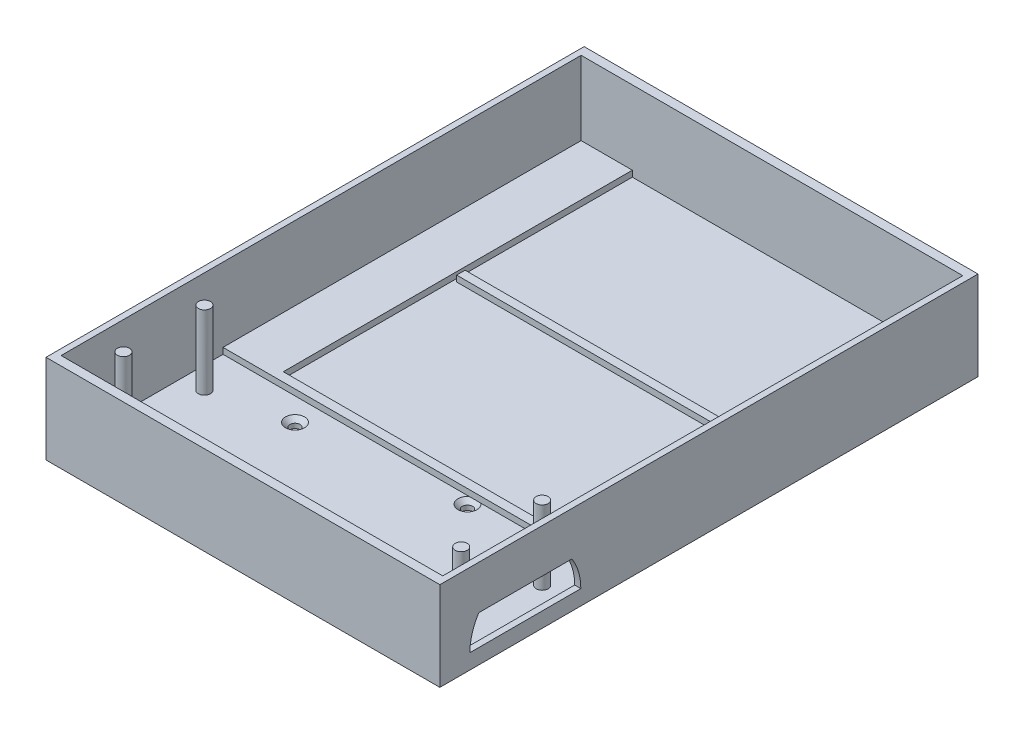
ISO-10303-21;
HEADER;
FILE_DESCRIPTION(('STEP AP214'),'2;1');
FILE_NAME('part.step','',(''),(''),'','','');
FILE_SCHEMA(('AUTOMOTIVE_DESIGN { 1 0 10303 214 1 1 1 1 }'));
ENDSEC;
DATA;
#1=APPLICATION_CONTEXT('core data for automotive mechanical design processes');
#2=APPLICATION_PROTOCOL_DEFINITION('international standard','automotive_design',2000,#1);
#3=PRODUCT_CONTEXT('',#1,'mechanical');
#4=PRODUCT('Part','Part','',(#3));
#5=PRODUCT_RELATED_PRODUCT_CATEGORY('part','',(#4));
#6=PRODUCT_DEFINITION_FORMATION('','',#4);
#7=PRODUCT_DEFINITION_CONTEXT('part definition',#1,'design');
#8=PRODUCT_DEFINITION('design','',#6,#7);
#9=PRODUCT_DEFINITION_SHAPE('','',#8);
#10=(LENGTH_UNIT() NAMED_UNIT(*) SI_UNIT(.MILLI.,.METRE.));
#11=(NAMED_UNIT(*) PLANE_ANGLE_UNIT() SI_UNIT($,.RADIAN.));
#12=(NAMED_UNIT(*) SI_UNIT($,.STERADIAN.) SOLID_ANGLE_UNIT());
#13=UNCERTAINTY_MEASURE_WITH_UNIT(LENGTH_MEASURE(1.E-05),#10,'distance_accuracy_value','');
#14=(GEOMETRIC_REPRESENTATION_CONTEXT(3) GLOBAL_UNCERTAINTY_ASSIGNED_CONTEXT((#13)) GLOBAL_UNIT_ASSIGNED_CONTEXT((#10,
#11,#12)) REPRESENTATION_CONTEXT('',''));
#15=CARTESIAN_POINT('',(0.,0.,0.));
#16=DIRECTION('',(0.,0.,1.));
#17=DIRECTION('',(1.,0.,0.));
#18=AXIS2_PLACEMENT_3D('',#15,#16,#17);
#19=CARTESIAN_POINT('',(0.,0.,0.));
#20=DIRECTION('',(0.,-1.,0.));
#21=DIRECTION('',(0.,0.,-1.));
#22=AXIS2_PLACEMENT_3D('',#19,#20,#21);
#23=PLANE('',#22);
#24=CARTESIAN_POINT('',(125.229028096428,0.,93.0079808969364));
#25=DIRECTION('',(0.,-1.,0.));
#26=DIRECTION('',(0.,0.,-1.));
#27=AXIS2_PLACEMENT_3D('',#24,#25,#26);
#28=CIRCLE('',#27,2.);
#29=CARTESIAN_POINT('',(125.229028096428,0.,91.0079808969364));
#30=VERTEX_POINT('',#29);
#31=EDGE_CURVE('E12',#30,#30,#28,.F.);
#32=ORIENTED_EDGE('',*,*,#31,.F.);
#33=EDGE_LOOP('',(#32));
#34=FACE_BOUND('',#33,.T.);
#35=CARTESIAN_POINT('',(13.2092889908256,0.,93.0079808969364));
#36=DIRECTION('',(0.,-1.,0.));
#37=DIRECTION('',(0.,0.,-1.));
#38=AXIS2_PLACEMENT_3D('',#35,#36,#37);
#39=CIRCLE('',#38,2.);
#40=CARTESIAN_POINT('',(13.2092889908256,0.,91.0079808969364));
#41=VERTEX_POINT('',#40);
#42=EDGE_CURVE('E115',#41,#41,#39,.F.);
#43=ORIENTED_EDGE('',*,*,#42,.F.);
#44=EDGE_LOOP('',(#43));
#45=FACE_BOUND('',#44,.T.);
#46=CARTESIAN_POINT('',(13.2092889908256,0.,119.857980896936));
#47=DIRECTION('',(0.,-1.,0.));
#48=DIRECTION('',(0.,0.,-1.));
#49=AXIS2_PLACEMENT_3D('',#46,#47,#48);
#50=CIRCLE('',#49,2.);
#51=CARTESIAN_POINT('',(13.2092889908256,0.,117.857980896936));
#52=VERTEX_POINT('',#51);
#53=EDGE_CURVE('E502',#52,#52,#50,.F.);
#54=ORIENTED_EDGE('',*,*,#53,.F.);
#55=EDGE_LOOP('',(#54));
#56=FACE_BOUND('',#55,.T.);
#57=CARTESIAN_POINT('',(125.229028096428,0.,119.857980896936));
#58=DIRECTION('',(0.,-1.,0.));
#59=DIRECTION('',(0.,0.,-1.));
#60=AXIS2_PLACEMENT_3D('',#57,#58,#59);
#61=CIRCLE('',#60,2.);
#62=CARTESIAN_POINT('',(125.229028096428,0.,117.857980896936));
#63=VERTEX_POINT('',#62);
#64=EDGE_CURVE('E499',#63,#63,#61,.F.);
#65=ORIENTED_EDGE('',*,*,#64,.F.);
#66=EDGE_LOOP('',(#65));
#67=FACE_BOUND('',#66,.T.);
#68=CARTESIAN_POINT('',(37.4340889908256,0.,87.1829808969364));
#69=DIRECTION('',(0.,1.,0.));
#70=DIRECTION('',(0.,0.,1.));
#71=AXIS2_PLACEMENT_3D('',#68,#69,#70);
#72=CIRCLE('',#71,3.15);
#73=CARTESIAN_POINT('',(37.4340889908256,0.,90.3329808969364));
#74=VERTEX_POINT('',#73);
#75=EDGE_CURVE('E385',#74,#74,#72,.T.);
#76=ORIENTED_EDGE('',*,*,#75,.F.);
#77=EDGE_LOOP('',(#76));
#78=FACE_BOUND('',#77,.T.);
#79=CARTESIAN_POINT('',(37.4340889908256,0.,115.082980896936));
#80=DIRECTION('',(0.,1.,0.));
#81=DIRECTION('',(0.,0.,1.));
#82=AXIS2_PLACEMENT_3D('',#79,#80,#81);
#83=CIRCLE('',#82,3.15);
#84=CARTESIAN_POINT('',(37.4340889908256,0.,118.232980896936));
#85=VERTEX_POINT('',#84);
#86=EDGE_CURVE('E376',#85,#85,#83,.T.);
#87=ORIENTED_EDGE('',*,*,#86,.F.);
#88=EDGE_LOOP('',(#87));
#89=FACE_BOUND('',#88,.T.);
#90=DIRECTION('',(0.,0.,-1.));
#91=VECTOR('',#90,1.);
#92=CARTESIAN_POINT('',(5.95678899082561,0.,133.282980896936));
#93=LINE('',#92,#91);
#94=CARTESIAN_POINT('',(5.95678899082561,0.,133.282980896936));
#95=VERTEX_POINT('',#94);
#96=CARTESIAN_POINT('',(5.95678899082561,0.,79.5829808969364));
#97=VERTEX_POINT('',#96);
#98=EDGE_CURVE('E346',#95,#97,#93,.T.);
#99=ORIENTED_EDGE('',*,*,#98,.F.);
#100=DIRECTION('',(1.,0.,0.));
#101=VECTOR('',#100,1.);
#102=CARTESIAN_POINT('',(0.,0.,133.282980896936));
#103=LINE('',#102,#101);
#104=CARTESIAN_POINT('',(87.2736203552105,0.,133.282980896936));
#105=VERTEX_POINT('',#104);
#106=EDGE_CURVE('E484',#95,#105,#103,.T.);
#107=ORIENTED_EDGE('',*,*,#106,.T.);
#108=CARTESIAN_POINT('',(88.2340889908256,0.,130.282980896936));
#109=DIRECTION('',(0.,1.,0.));
#110=DIRECTION('',(0.,0.,1.));
#111=AXIS2_PLACEMENT_3D('',#108,#109,#110);
#112=CIRCLE('',#111,3.15);
#113=CARTESIAN_POINT('',(89.1945576264407,0.,133.282980896936));
#114=VERTEX_POINT('',#113);
#115=EDGE_CURVE('E367',#114,#105,#112,.T.);
#116=ORIENTED_EDGE('',*,*,#115,.F.);
#117=CARTESIAN_POINT('',(132.529028096428,0.,133.282980896936));
#118=VERTEX_POINT('',#117);
#119=EDGE_CURVE('E483',#114,#118,#103,.T.);
#120=ORIENTED_EDGE('',*,*,#119,.T.);
#121=DIRECTION('',(0.,0.,1.));
#122=VECTOR('',#121,1.);
#123=CARTESIAN_POINT('',(132.529028096428,0.,133.282980896936));
#124=LINE('',#123,#122);
#125=CARTESIAN_POINT('',(132.529028096428,0.,79.5829808969364));
#126=VERTEX_POINT('',#125);
#127=EDGE_CURVE('E359',#126,#118,#124,.T.);
#128=ORIENTED_EDGE('',*,*,#127,.F.);
#129=DIRECTION('',(1.,0.,0.));
#130=VECTOR('',#129,1.);
#131=CARTESIAN_POINT('',(0.,0.,79.5829808969364));
#132=LINE('',#131,#130);
#133=CARTESIAN_POINT('',(91.4504657804992,0.,79.5829808969364));
#134=VERTEX_POINT('',#133);
#135=EDGE_CURVE('E425',#134,#126,#132,.T.);
#136=ORIENTED_EDGE('',*,*,#135,.F.);
#137=CARTESIAN_POINT('',(89.5340889908256,0.,82.0829808969364));
#138=DIRECTION('',(0.,1.,0.));
#139=DIRECTION('',(0.,0.,1.));
#140=AXIS2_PLACEMENT_3D('',#137,#138,#139);
#141=CIRCLE('',#140,3.15);
#142=CARTESIAN_POINT('',(87.617712201152,0.,79.5829808969364));
#143=VERTEX_POINT('',#142);
#144=EDGE_CURVE('E394',#143,#134,#141,.T.);
#145=ORIENTED_EDGE('',*,*,#144,.F.);
#146=EDGE_CURVE('E409',#97,#143,#132,.T.);
#147=ORIENTED_EDGE('',*,*,#146,.F.);
#148=EDGE_LOOP('',(#99,#107,#116,#120,#128,#136,#145,#147));
#149=FACE_BOUND('',#148,.T.);
#150=ADVANCED_FACE('F107',(#34,#45,#56,#67,#78,#89,#149),#23,.F.);
#151=CARTESIAN_POINT('',(0.,2.,79.5829808969364));
#152=DIRECTION('',(0.,0.,-1.));
#153=DIRECTION('',(-1.,0.,0.));
#154=AXIS2_PLACEMENT_3D('',#151,#152,#153);
#155=PLANE('',#154);
#156=DIRECTION('',(0.,-1.,0.));
#157=VECTOR('',#156,1.);
#158=CARTESIAN_POINT('',(5.95678899082561,24.,79.5829808969364));
#159=LINE('',#158,#157);
#160=CARTESIAN_POINT('',(5.95678899082561,2.,79.5829808969364));
#161=VERTEX_POINT('',#160);
#162=EDGE_CURVE('E354',#161,#97,#159,.T.);
#163=ORIENTED_EDGE('',*,*,#162,.T.);
#164=ORIENTED_EDGE('',*,*,#146,.T.);
#165=EDGE_CURVE('E427',#143,#134,#132,.T.);
#166=ORIENTED_EDGE('',*,*,#165,.T.);
#167=ORIENTED_EDGE('',*,*,#135,.T.);
#168=DIRECTION('',(0.,-1.,0.));
#169=VECTOR('',#168,1.);
#170=CARTESIAN_POINT('',(132.529028096428,24.,79.5829808969364));
#171=LINE('',#170,#169);
#172=CARTESIAN_POINT('',(132.529028096428,2.,79.5829808969364));
#173=VERTEX_POINT('',#172);
#174=EDGE_CURVE('E364',#173,#126,#171,.T.);
#175=ORIENTED_EDGE('',*,*,#174,.F.);
#176=DIRECTION('',(1.,0.,0.));
#177=VECTOR('',#176,1.);
#178=CARTESIAN_POINT('',(0.,2.,79.5829808969364));
#179=LINE('',#178,#177);
#180=EDGE_CURVE('E413',#161,#173,#179,.T.);
#181=ORIENTED_EDGE('',*,*,#180,.F.);
#182=EDGE_LOOP('',(#163,#164,#166,#167,#175,#181));
#183=FACE_BOUND('',#182,.T.);
#184=ADVANCED_FACE('F511',(#183),#155,.F.);
#185=CARTESIAN_POINT('',(0.,2.,133.282980896936));
#186=DIRECTION('',(0.,0.,-1.));
#187=DIRECTION('',(-1.,0.,0.));
#188=AXIS2_PLACEMENT_3D('',#185,#186,#187);
#189=PLANE('',#188);
#190=ORIENTED_EDGE('',*,*,#106,.F.);
#191=DIRECTION('',(0.,-1.,0.));
#192=VECTOR('',#191,1.);
#193=CARTESIAN_POINT('',(5.95678899082561,24.,133.282980896936));
#194=LINE('',#193,#192);
#195=CARTESIAN_POINT('',(5.95678899082561,26.5,133.282980896936));
#196=VERTEX_POINT('',#195);
#197=EDGE_CURVE('E357',#196,#95,#194,.T.);
#198=ORIENTED_EDGE('',*,*,#197,.F.);
#199=DIRECTION('',(-1.,0.,0.));
#200=VECTOR('',#199,1.);
#201=CARTESIAN_POINT('',(0.,26.5,133.282980896936));
#202=LINE('',#201,#200);
#203=CARTESIAN_POINT('',(132.529028096428,26.5,133.282980896936));
#204=VERTEX_POINT('',#203);
#205=EDGE_CURVE('E299',#204,#196,#202,.T.);
#206=ORIENTED_EDGE('',*,*,#205,.F.);
#207=DIRECTION('',(0.,-1.,0.));
#208=VECTOR('',#207,1.);
#209=CARTESIAN_POINT('',(132.529028096428,24.,133.282980896936));
#210=LINE('',#209,#208);
#211=EDGE_CURVE('E361',#204,#118,#210,.T.);
#212=ORIENTED_EDGE('',*,*,#211,.T.);
#213=ORIENTED_EDGE('',*,*,#119,.F.);
#214=EDGE_CURVE('E486',#105,#114,#103,.T.);
#215=ORIENTED_EDGE('',*,*,#214,.F.);
#216=EDGE_LOOP('',(#190,#198,#206,#212,#213,#215));
#217=FACE_BOUND('',#216,.T.);
#218=ADVANCED_FACE('F533',(#217),#189,.T.);
#219=DIRECTION('',(0.,0.,-1.));
#220=VECTOR('',#219,1.);
#221=CARTESIAN_POINT('',(22.9467889908256,0.,0.));
#222=LINE('',#221,#220);
#223=CARTESIAN_POINT('',(22.9467889908256,0.,76.5829808969364));
#224=VERTEX_POINT('',#223);
#225=CARTESIAN_POINT('',(22.9467889908256,0.,-39.175622542595));
#226=VERTEX_POINT('',#225);
#227=EDGE_CURVE('E417',#224,#226,#222,.T.);
#228=ORIENTED_EDGE('',*,*,#227,.F.);
#229=DIRECTION('',(1.,0.,0.));
#230=VECTOR('',#229,1.);
#231=CARTESIAN_POINT('',(0.,0.,76.5829808969364));
#232=LINE('',#231,#230);
#233=CARTESIAN_POINT('',(109.146788990826,0.,76.5829808969364));
#234=VERTEX_POINT('',#233);
#235=EDGE_CURVE('E404',#224,#234,#232,.T.);
#236=ORIENTED_EDGE('',*,*,#235,.T.);
#237=DIRECTION('',(0.,0.,1.));
#238=VECTOR('',#237,1.);
#239=CARTESIAN_POINT('',(109.146788990826,0.,0.));
#240=LINE('',#239,#238);
#241=CARTESIAN_POINT('',(109.146788990826,0.,-39.1756225425949));
#242=VERTEX_POINT('',#241);
#243=EDGE_CURVE('E422',#242,#234,#240,.T.);
#244=ORIENTED_EDGE('',*,*,#243,.F.);
#245=DIRECTION('',(-1.,0.,0.));
#246=VECTOR('',#245,1.);
#247=CARTESIAN_POINT('',(1.81223658961723E-13,0.,-39.1756225425951));
#248=LINE('',#247,#246);
#249=EDGE_CURVE('E420',#242,#226,#248,.T.);
#250=ORIENTED_EDGE('',*,*,#249,.T.);
#251=EDGE_LOOP('',(#228,#236,#244,#250));
#252=FACE_BOUND('',#251,.T.);
#253=DIRECTION('',(1.,0.,0.));
#254=VECTOR('',#253,1.);
#255=CARTESIAN_POINT('',(0.,0.,17.2843774574049));
#256=LINE('',#255,#254);
#257=CARTESIAN_POINT('',(23.9467889908256,0.,17.2843774574049));
#258=VERTEX_POINT('',#257);
#259=CARTESIAN_POINT('',(108.146788990826,0.,17.2843774574049));
#260=VERTEX_POINT('',#259);
#261=EDGE_CURVE('E453',#258,#260,#256,.T.);
#262=ORIENTED_EDGE('',*,*,#261,.T.);
#263=DIRECTION('',(0.,0.,1.));
#264=VECTOR('',#263,1.);
#265=CARTESIAN_POINT('',(108.146788990826,0.,0.));
#266=LINE('',#265,#264);
#267=CARTESIAN_POINT('',(108.146788990826,0.,20.0829808969364));
#268=VERTEX_POINT('',#267);
#269=EDGE_CURVE('E439',#260,#268,#266,.T.);
#270=ORIENTED_EDGE('',*,*,#269,.T.);
#271=DIRECTION('',(1.,0.,0.));
#272=VECTOR('',#271,1.);
#273=CARTESIAN_POINT('',(0.,0.,20.0829808969364));
#274=LINE('',#273,#272);
#275=CARTESIAN_POINT('',(23.9467889908256,0.,20.0829808969364));
#276=VERTEX_POINT('',#275);
#277=EDGE_CURVE('E444',#276,#268,#274,.T.);
#278=ORIENTED_EDGE('',*,*,#277,.F.);
#279=DIRECTION('',(0.,0.,1.));
#280=VECTOR('',#279,1.);
#281=CARTESIAN_POINT('',(23.9467889908256,0.,0.));
#282=LINE('',#281,#280);
#283=EDGE_CURVE('E455',#258,#276,#282,.T.);
#284=ORIENTED_EDGE('',*,*,#283,.F.);
#285=EDGE_LOOP('',(#262,#270,#278,#284));
#286=FACE_BOUND('',#285,.T.);
#287=ADVANCED_FACE('F514',(#252,#286),#23,.F.);
#288=CARTESIAN_POINT('',(108.146788990826,2.,0.));
#289=DIRECTION('',(1.,0.,0.));
#290=DIRECTION('',(0.,0.,-1.));
#291=AXIS2_PLACEMENT_3D('',#288,#289,#290);
#292=PLANE('',#291);
#293=ORIENTED_EDGE('',*,*,#269,.F.);
#294=DIRECTION('',(0.,-1.,0.));
#295=VECTOR('',#294,1.);
#296=CARTESIAN_POINT('',(108.146788990826,2.,17.2843774574049));
#297=LINE('',#296,#295);
#298=CARTESIAN_POINT('',(108.146788990826,2.,17.2843774574049));
#299=VERTEX_POINT('',#298);
#300=EDGE_CURVE('E468',#299,#260,#297,.T.);
#301=ORIENTED_EDGE('',*,*,#300,.F.);
#302=DIRECTION('',(0.,0.,1.));
#303=VECTOR('',#302,1.);
#304=CARTESIAN_POINT('',(108.146788990826,2.,0.));
#305=LINE('',#304,#303);
#306=CARTESIAN_POINT('',(108.146788990826,2.,20.0829808969364));
#307=VERTEX_POINT('',#306);
#308=EDGE_CURVE('E440',#299,#307,#305,.T.);
#309=ORIENTED_EDGE('',*,*,#308,.T.);
#310=DIRECTION('',(0.,-1.,0.));
#311=VECTOR('',#310,1.);
#312=CARTESIAN_POINT('',(108.146788990826,2.,20.0829808969364));
#313=LINE('',#312,#311);
#314=EDGE_CURVE('E451',#307,#268,#313,.T.);
#315=ORIENTED_EDGE('',*,*,#314,.T.);
#316=EDGE_LOOP('',(#293,#301,#309,#315));
#317=FACE_BOUND('',#316,.T.);
#318=ADVANCED_FACE('F621',(#317),#292,.T.);
#319=CARTESIAN_POINT('',(0.,2.,17.2843774574049));
#320=DIRECTION('',(0.,0.,-1.));
#321=DIRECTION('',(-1.,0.,0.));
#322=AXIS2_PLACEMENT_3D('',#319,#320,#321);
#323=PLANE('',#322);
#324=ORIENTED_EDGE('',*,*,#261,.F.);
#325=DIRECTION('',(0.,-1.,0.));
#326=VECTOR('',#325,1.);
#327=CARTESIAN_POINT('',(23.9467889908255,2.,17.2843774574049));
#328=LINE('',#327,#326);
#329=CARTESIAN_POINT('',(23.9467889908255,2.,17.2843774574049));
#330=VERTEX_POINT('',#329);
#331=EDGE_CURVE('E465',#330,#258,#328,.T.);
#332=ORIENTED_EDGE('',*,*,#331,.F.);
#333=DIRECTION('',(1.,0.,0.));
#334=VECTOR('',#333,1.);
#335=CARTESIAN_POINT('',(0.,2.,17.2843774574049));
#336=LINE('',#335,#334);
#337=EDGE_CURVE('E443',#330,#299,#336,.T.);
#338=ORIENTED_EDGE('',*,*,#337,.T.);
#339=ORIENTED_EDGE('',*,*,#300,.T.);
#340=EDGE_LOOP('',(#324,#332,#338,#339));
#341=FACE_BOUND('',#340,.T.);
#342=ADVANCED_FACE('F617',(#341),#323,.T.);
#343=CARTESIAN_POINT('',(23.9467889908256,2.,0.));
#344=DIRECTION('',(1.,0.,0.));
#345=DIRECTION('',(0.,0.,-1.));
#346=AXIS2_PLACEMENT_3D('',#343,#344,#345);
#347=PLANE('',#346);
#348=ORIENTED_EDGE('',*,*,#283,.T.);
#349=DIRECTION('',(0.,-1.,0.));
#350=VECTOR('',#349,1.);
#351=CARTESIAN_POINT('',(23.9467889908256,2.,20.0829808969364));
#352=LINE('',#351,#350);
#353=CARTESIAN_POINT('',(23.9467889908256,2.,20.0829808969364));
#354=VERTEX_POINT('',#353);
#355=EDGE_CURVE('E462',#354,#276,#352,.T.);
#356=ORIENTED_EDGE('',*,*,#355,.F.);
#357=DIRECTION('',(0.,0.,1.));
#358=VECTOR('',#357,1.);
#359=CARTESIAN_POINT('',(23.9467889908256,2.,0.));
#360=LINE('',#359,#358);
#361=EDGE_CURVE('E447',#330,#354,#360,.T.);
#362=ORIENTED_EDGE('',*,*,#361,.F.);
#363=ORIENTED_EDGE('',*,*,#331,.T.);
#364=EDGE_LOOP('',(#348,#356,#362,#363));
#365=FACE_BOUND('',#364,.T.);
#366=ADVANCED_FACE('F613',(#365),#347,.F.);
#367=CARTESIAN_POINT('',(0.,2.,20.0829808969364));
#368=DIRECTION('',(0.,0.,-1.));
#369=DIRECTION('',(-1.,0.,0.));
#370=AXIS2_PLACEMENT_3D('',#367,#368,#369);
#371=PLANE('',#370);
#372=ORIENTED_EDGE('',*,*,#277,.T.);
#373=ORIENTED_EDGE('',*,*,#314,.F.);
#374=DIRECTION('',(1.,0.,0.));
#375=VECTOR('',#374,1.);
#376=CARTESIAN_POINT('',(0.,2.,20.0829808969364));
#377=LINE('',#376,#375);
#378=EDGE_CURVE('E449',#354,#307,#377,.T.);
#379=ORIENTED_EDGE('',*,*,#378,.F.);
#380=ORIENTED_EDGE('',*,*,#355,.T.);
#381=EDGE_LOOP('',(#372,#373,#379,#380));
#382=FACE_BOUND('',#381,.T.);
#383=ADVANCED_FACE('F609',(#382),#371,.F.);
#384=CARTESIAN_POINT('',(0.,2.,0.));
#385=DIRECTION('',(0.,1.,0.));
#386=DIRECTION('',(0.,0.,1.));
#387=AXIS2_PLACEMENT_3D('',#384,#385,#386);
#388=PLANE('',#387);
#389=ORIENTED_EDGE('',*,*,#308,.F.);
#390=ORIENTED_EDGE('',*,*,#337,.F.);
#391=ORIENTED_EDGE('',*,*,#361,.T.);
#392=ORIENTED_EDGE('',*,*,#378,.T.);
#393=EDGE_LOOP('',(#389,#390,#391,#392));
#394=FACE_BOUND('',#393,.T.);
#395=ADVANCED_FACE('F605',(#394),#388,.T.);
#396=CARTESIAN_POINT('',(0.,2.,76.5829808969364));
#397=DIRECTION('',(0.,0.,-1.));
#398=DIRECTION('',(-1.,0.,0.));
#399=AXIS2_PLACEMENT_3D('',#396,#397,#398);
#400=PLANE('',#399);
#401=ORIENTED_EDGE('',*,*,#235,.F.);
#402=DIRECTION('',(0.,-1.,0.));
#403=VECTOR('',#402,1.);
#404=CARTESIAN_POINT('',(22.9467889908256,2.,76.5829808969364));
#405=LINE('',#404,#403);
#406=CARTESIAN_POINT('',(22.9467889908256,2.,76.5829808969364));
#407=VERTEX_POINT('',#406);
#408=EDGE_CURVE('E436',#407,#224,#405,.T.);
#409=ORIENTED_EDGE('',*,*,#408,.F.);
#410=DIRECTION('',(1.,0.,0.));
#411=VECTOR('',#410,1.);
#412=CARTESIAN_POINT('',(0.,2.,76.5829808969364));
#413=LINE('',#412,#411);
#414=CARTESIAN_POINT('',(109.146788990826,2.,76.5829808969364));
#415=VERTEX_POINT('',#414);
#416=EDGE_CURVE('E405',#407,#415,#413,.T.);
#417=ORIENTED_EDGE('',*,*,#416,.T.);
#418=DIRECTION('',(0.,-1.,0.));
#419=VECTOR('',#418,1.);
#420=CARTESIAN_POINT('',(109.146788990826,2.,76.5829808969364));
#421=LINE('',#420,#419);
#422=EDGE_CURVE('E415',#415,#234,#421,.T.);
#423=ORIENTED_EDGE('',*,*,#422,.T.);
#424=EDGE_LOOP('',(#401,#409,#417,#423));
#425=FACE_BOUND('',#424,.T.);
#426=ADVANCED_FACE('F601',(#425),#400,.T.);
#427=CARTESIAN_POINT('',(22.9467889908256,2.,0.));
#428=DIRECTION('',(-1.,0.,0.));
#429=DIRECTION('',(0.,0.,1.));
#430=AXIS2_PLACEMENT_3D('',#427,#428,#429);
#431=PLANE('',#430);
#432=ORIENTED_EDGE('',*,*,#227,.T.);
#433=DIRECTION('',(0.,-1.,0.));
#434=VECTOR('',#433,1.);
#435=CARTESIAN_POINT('',(22.9467889908256,2.,-39.1756225425951));
#436=LINE('',#435,#434);
#437=CARTESIAN_POINT('',(22.9467889908256,2.,-39.1756225425951));
#438=VERTEX_POINT('',#437);
#439=EDGE_CURVE('E433',#438,#226,#436,.T.);
#440=ORIENTED_EDGE('',*,*,#439,.F.);
#441=DIRECTION('',(0.,0.,-1.));
#442=VECTOR('',#441,1.);
#443=CARTESIAN_POINT('',(22.9467889908256,2.,0.));
#444=LINE('',#443,#442);
#445=EDGE_CURVE('E408',#407,#438,#444,.T.);
#446=ORIENTED_EDGE('',*,*,#445,.F.);
#447=ORIENTED_EDGE('',*,*,#408,.T.);
#448=EDGE_LOOP('',(#432,#440,#446,#447));
#449=FACE_BOUND('',#448,.T.);
#450=ADVANCED_FACE('F597',(#449),#431,.F.);
#451=CARTESIAN_POINT('',(1.81223658961723E-13,2.,-39.1756225425951));
#452=DIRECTION('',(0.,0.,1.));
#453=DIRECTION('',(1.,0.,0.));
#454=AXIS2_PLACEMENT_3D('',#451,#452,#453);
#455=PLANE('',#454);
#456=ORIENTED_EDGE('',*,*,#249,.F.);
#457=DIRECTION('',(0.,-1.,0.));
#458=VECTOR('',#457,1.);
#459=CARTESIAN_POINT('',(109.146788990826,2.,-39.1756225425949));
#460=LINE('',#459,#458);
#461=CARTESIAN_POINT('',(109.146788990826,2.,-39.1756225425949));
#462=VERTEX_POINT('',#461);
#463=EDGE_CURVE('E430',#462,#242,#460,.T.);
#464=ORIENTED_EDGE('',*,*,#463,.F.);
#465=DIRECTION('',(-1.,0.,0.));
#466=VECTOR('',#465,1.);
#467=CARTESIAN_POINT('',(0.,2.,-39.175622542595));
#468=LINE('',#467,#466);
#469=CARTESIAN_POINT('',(132.529028096428,2.,-39.175622542595));
#470=VERTEX_POINT('',#469);
#471=EDGE_CURVE('E324',#470,#462,#468,.T.);
#472=ORIENTED_EDGE('',*,*,#471,.F.);
#473=DIRECTION('',(0.,-1.,0.));
#474=VECTOR('',#473,1.);
#475=CARTESIAN_POINT('',(132.529028096428,24.,-39.175622542595));
#476=LINE('',#475,#474);
#477=CARTESIAN_POINT('',(132.529028096428,26.5,-39.175622542595));
#478=VERTEX_POINT('',#477);
#479=EDGE_CURVE('E326',#478,#470,#476,.T.);
#480=ORIENTED_EDGE('',*,*,#479,.F.);
#481=DIRECTION('',(1.,0.,0.));
#482=VECTOR('',#481,1.);
#483=CARTESIAN_POINT('',(0.,26.5,-39.175622542595));
#484=LINE('',#483,#482);
#485=CARTESIAN_POINT('',(5.95678899082561,26.5,-39.175622542595));
#486=VERTEX_POINT('',#485);
#487=EDGE_CURVE('E305',#486,#478,#484,.T.);
#488=ORIENTED_EDGE('',*,*,#487,.F.);
#489=DIRECTION('',(0.,-1.,0.));
#490=VECTOR('',#489,1.);
#491=CARTESIAN_POINT('',(5.95678899082561,24.,-39.175622542595));
#492=LINE('',#491,#490);
#493=CARTESIAN_POINT('',(5.95678899082561,2.,-39.175622542595));
#494=VERTEX_POINT('',#493);
#495=EDGE_CURVE('E328',#486,#494,#492,.T.);
#496=ORIENTED_EDGE('',*,*,#495,.T.);
#497=EDGE_CURVE('E129',#438,#494,#468,.T.);
#498=ORIENTED_EDGE('',*,*,#497,.F.);
#499=ORIENTED_EDGE('',*,*,#439,.T.);
#500=EDGE_LOOP('',(#456,#464,#472,#480,#488,#496,#498,#499));
#501=FACE_BOUND('',#500,.T.);
#502=ADVANCED_FACE('F593',(#501),#455,.T.);
#503=CARTESIAN_POINT('',(109.146788990826,2.,0.));
#504=DIRECTION('',(1.,0.,0.));
#505=DIRECTION('',(0.,0.,-1.));
#506=AXIS2_PLACEMENT_3D('',#503,#504,#505);
#507=PLANE('',#506);
#508=ORIENTED_EDGE('',*,*,#243,.T.);
#509=ORIENTED_EDGE('',*,*,#422,.F.);
#510=DIRECTION('',(0.,0.,1.));
#511=VECTOR('',#510,1.);
#512=CARTESIAN_POINT('',(109.146788990826,2.,0.));
#513=LINE('',#512,#511);
#514=EDGE_CURVE('E411',#462,#415,#513,.T.);
#515=ORIENTED_EDGE('',*,*,#514,.F.);
#516=ORIENTED_EDGE('',*,*,#463,.T.);
#517=EDGE_LOOP('',(#508,#509,#515,#516));
#518=FACE_BOUND('',#517,.T.);
#519=ADVANCED_FACE('F587',(#518),#507,.F.);
#520=CARTESIAN_POINT('',(0.,2.,0.));
#521=DIRECTION('',(0.,1.,0.));
#522=DIRECTION('',(0.,0.,1.));
#523=AXIS2_PLACEMENT_3D('',#520,#521,#522);
#524=PLANE('',#523);
#525=ORIENTED_EDGE('',*,*,#471,.T.);
#526=ORIENTED_EDGE('',*,*,#514,.T.);
#527=ORIENTED_EDGE('',*,*,#416,.F.);
#528=ORIENTED_EDGE('',*,*,#445,.T.);
#529=ORIENTED_EDGE('',*,*,#497,.T.);
#530=DIRECTION('',(0.,0.,1.));
#531=VECTOR('',#530,1.);
#532=CARTESIAN_POINT('',(5.95678899082561,2.,-42.1756225425951));
#533=LINE('',#532,#531);
#534=EDGE_CURVE('E323',#494,#161,#533,.T.);
#535=ORIENTED_EDGE('',*,*,#534,.T.);
#536=ORIENTED_EDGE('',*,*,#180,.T.);
#537=DIRECTION('',(0.,0.,1.));
#538=VECTOR('',#537,1.);
#539=CARTESIAN_POINT('',(132.529028096428,2.,-42.1756225425951));
#540=LINE('',#539,#538);
#541=EDGE_CURVE('E122',#470,#173,#540,.T.);
#542=ORIENTED_EDGE('',*,*,#541,.F.);
#543=EDGE_LOOP('',(#525,#526,#527,#528,#529,#535,#536,#542));
#544=FACE_BOUND('',#543,.T.);
#545=ADVANCED_FACE('F584',(#544),#524,.T.);
#546=CARTESIAN_POINT('',(0.,2.,136.282980896936));
#547=DIRECTION('',(0.,0.,-1.));
#548=DIRECTION('',(-1.,0.,0.));
#549=AXIS2_PLACEMENT_3D('',#546,#547,#548);
#550=PLANE('',#549);
#551=DIRECTION('',(0.,-1.,0.));
#552=VECTOR('',#551,1.);
#553=CARTESIAN_POINT('',(3.9567889908256,2.,136.282980896936));
#554=LINE('',#553,#552);
#555=CARTESIAN_POINT('',(3.95678899082561,26.5,136.282980896936));
#556=VERTEX_POINT('',#555);
#557=CARTESIAN_POINT('',(3.9567889908256,-3.,136.282980896936));
#558=VERTEX_POINT('',#557);
#559=EDGE_CURVE('E268',#556,#558,#554,.T.);
#560=ORIENTED_EDGE('',*,*,#559,.T.);
#561=DIRECTION('',(-1.,0.,0.));
#562=VECTOR('',#561,1.);
#563=CARTESIAN_POINT('',(3.9567889908256,-3.,136.282980896936));
#564=LINE('',#563,#562);
#565=CARTESIAN_POINT('',(134.576788990826,-3.,136.282980896936));
#566=VERTEX_POINT('',#565);
#567=EDGE_CURVE('E477',#566,#558,#564,.T.);
#568=ORIENTED_EDGE('',*,*,#567,.F.);
#569=DIRECTION('',(0.,-1.,0.));
#570=VECTOR('',#569,1.);
#571=CARTESIAN_POINT('',(134.576788990826,2.,136.282980896936));
#572=LINE('',#571,#570);
#573=CARTESIAN_POINT('',(134.576788990826,26.5,136.282980896936));
#574=VERTEX_POINT('',#573);
#575=EDGE_CURVE('E280',#574,#566,#572,.T.);
#576=ORIENTED_EDGE('',*,*,#575,.F.);
#577=DIRECTION('',(1.,0.,0.));
#578=VECTOR('',#577,1.);
#579=CARTESIAN_POINT('',(0.,26.5,136.282980896936));
#580=LINE('',#579,#578);
#581=EDGE_CURVE('E283',#556,#574,#580,.T.);
#582=ORIENTED_EDGE('',*,*,#581,.F.);
#583=EDGE_LOOP('',(#560,#568,#576,#582));
#584=FACE_BOUND('',#583,.T.);
#585=ADVANCED_FACE('F284',(#584),#550,.F.);
#586=CARTESIAN_POINT('',(0.,-3.,0.));
#587=DIRECTION('',(0.,-1.,0.));
#588=DIRECTION('',(0.,0.,-1.));
#589=AXIS2_PLACEMENT_3D('',#586,#587,#588);
#590=PLANE('',#589);
#591=CARTESIAN_POINT('',(88.2340889908256,-3.,130.282980896936));
#592=DIRECTION('',(0.,1.,0.));
#593=DIRECTION('',(0.,0.,1.));
#594=AXIS2_PLACEMENT_3D('',#591,#592,#593);
#595=CIRCLE('',#594,1.69999999999999);
#596=CARTESIAN_POINT('',(88.2340889908256,-3.,131.982980896936));
#597=VERTEX_POINT('',#596);
#598=EDGE_CURVE('E373',#597,#597,#595,.T.);
#599=ORIENTED_EDGE('',*,*,#598,.T.);
#600=EDGE_LOOP('',(#599));
#601=FACE_BOUND('',#600,.T.);
#602=CARTESIAN_POINT('',(37.4340889908256,-3.,115.082980896936));
#603=DIRECTION('',(0.,1.,0.));
#604=DIRECTION('',(0.,0.,1.));
#605=AXIS2_PLACEMENT_3D('',#602,#603,#604);
#606=CIRCLE('',#605,1.7);
#607=CARTESIAN_POINT('',(37.4340889908256,-3.,116.782980896936));
#608=VERTEX_POINT('',#607);
#609=EDGE_CURVE('E382',#608,#608,#606,.T.);
#610=ORIENTED_EDGE('',*,*,#609,.T.);
#611=EDGE_LOOP('',(#610));
#612=FACE_BOUND('',#611,.T.);
#613=CARTESIAN_POINT('',(37.4340889908256,-3.,87.1829808969364));
#614=DIRECTION('',(0.,1.,0.));
#615=DIRECTION('',(0.,0.,1.));
#616=AXIS2_PLACEMENT_3D('',#613,#614,#615);
#617=CIRCLE('',#616,1.7);
#618=CARTESIAN_POINT('',(37.4340889908256,-3.,88.8829808969364));
#619=VERTEX_POINT('',#618);
#620=EDGE_CURVE('E391',#619,#619,#617,.T.);
#621=ORIENTED_EDGE('',*,*,#620,.T.);
#622=EDGE_LOOP('',(#621));
#623=FACE_BOUND('',#622,.T.);
#624=CARTESIAN_POINT('',(89.5340889908256,-3.,82.0829808969364));
#625=DIRECTION('',(0.,1.,0.));
#626=DIRECTION('',(0.,0.,1.));
#627=AXIS2_PLACEMENT_3D('',#624,#625,#626);
#628=CIRCLE('',#627,1.69999999999999);
#629=CARTESIAN_POINT('',(89.5340889908256,-3.,83.7829808969364));
#630=VERTEX_POINT('',#629);
#631=EDGE_CURVE('E401',#630,#630,#628,.T.);
#632=ORIENTED_EDGE('',*,*,#631,.T.);
#633=EDGE_LOOP('',(#632));
#634=FACE_BOUND('',#633,.T.);
#635=DIRECTION('',(0.,0.,-1.));
#636=VECTOR('',#635,1.);
#637=CARTESIAN_POINT('',(3.9567889908256,-3.,136.282980896936));
#638=LINE('',#637,#636);
#639=CARTESIAN_POINT('',(3.9567889908256,-3.,-42.1756225425951));
#640=VERTEX_POINT('',#639);
#641=EDGE_CURVE('E275',#558,#640,#638,.T.);
#642=ORIENTED_EDGE('',*,*,#641,.T.);
#643=DIRECTION('',(1.,0.,0.));
#644=VECTOR('',#643,1.);
#645=CARTESIAN_POINT('',(3.9567889908256,-3.,-42.1756225425951));
#646=LINE('',#645,#644);
#647=CARTESIAN_POINT('',(134.576788990826,-3.,-42.1756225425951));
#648=VERTEX_POINT('',#647);
#649=EDGE_CURVE('E472',#640,#648,#646,.T.);
#650=ORIENTED_EDGE('',*,*,#649,.T.);
#651=DIRECTION('',(0.,0.,1.));
#652=VECTOR('',#651,1.);
#653=CARTESIAN_POINT('',(134.576788990826,-3.,136.282980896936));
#654=LINE('',#653,#652);
#655=EDGE_CURVE('E474',#648,#566,#654,.T.);
#656=ORIENTED_EDGE('',*,*,#655,.T.);
#657=ORIENTED_EDGE('',*,*,#567,.T.);
#658=EDGE_LOOP('',(#642,#650,#656,#657));
#659=FACE_BOUND('',#658,.T.);
#660=ADVANCED_FACE('F626',(#601,#612,#623,#634,#659),#590,.T.);
#661=CARTESIAN_POINT('',(3.9567889908256,-3.,-42.1756225425951));
#662=DIRECTION('',(0.,0.,1.));
#663=DIRECTION('',(1.,0.,0.));
#664=AXIS2_PLACEMENT_3D('',#661,#662,#663);
#665=PLANE('',#664);
#666=DIRECTION('',(0.,1.,0.));
#667=VECTOR('',#666,1.);
#668=CARTESIAN_POINT('',(3.9567889908256,-3.,-42.1756225425951));
#669=LINE('',#668,#667);
#670=CARTESIAN_POINT('',(3.95678899082561,26.5,-42.1756225425951));
#671=VERTEX_POINT('',#670);
#672=EDGE_CURVE('E481',#640,#671,#669,.T.);
#673=ORIENTED_EDGE('',*,*,#672,.T.);
#674=DIRECTION('',(-1.,0.,0.));
#675=VECTOR('',#674,1.);
#676=CARTESIAN_POINT('',(0.,26.5,-42.1756225425951));
#677=LINE('',#676,#675);
#678=CARTESIAN_POINT('',(134.576788990826,26.5,-42.1756225425951));
#679=VERTEX_POINT('',#678);
#680=EDGE_CURVE('E294',#679,#671,#677,.T.);
#681=ORIENTED_EDGE('',*,*,#680,.F.);
#682=DIRECTION('',(0.,1.,0.));
#683=VECTOR('',#682,1.);
#684=CARTESIAN_POINT('',(134.576788990826,-3.,-42.1756225425951));
#685=LINE('',#684,#683);
#686=EDGE_CURVE('E479',#648,#679,#685,.T.);
#687=ORIENTED_EDGE('',*,*,#686,.F.);
#688=ORIENTED_EDGE('',*,*,#649,.F.);
#689=EDGE_LOOP('',(#673,#681,#687,#688));
#690=FACE_BOUND('',#689,.T.);
#691=ADVANCED_FACE('F628',(#690),#665,.F.);
#692=CARTESIAN_POINT('',(3.95678899082595,2.,0.));
#693=DIRECTION('',(1.,0.,0.));
#694=DIRECTION('',(0.,0.,-1.));
#695=AXIS2_PLACEMENT_3D('',#692,#693,#694);
#696=PLANE('',#695);
#697=ORIENTED_EDGE('',*,*,#559,.F.);
#698=DIRECTION('',(0.,0.,1.));
#699=VECTOR('',#698,1.);
#700=CARTESIAN_POINT('',(3.95678899082561,26.5,0.));
#701=LINE('',#700,#699);
#702=EDGE_CURVE('E273',#671,#556,#701,.T.);
#703=ORIENTED_EDGE('',*,*,#702,.F.);
#704=ORIENTED_EDGE('',*,*,#672,.F.);
#705=ORIENTED_EDGE('',*,*,#641,.F.);
#706=EDGE_LOOP('',(#697,#703,#704,#705));
#707=FACE_BOUND('',#706,.T.);
#708=ADVANCED_FACE('F270',(#707),#696,.F.);
#709=CARTESIAN_POINT('',(134.576788990826,2.,0.));
#710=DIRECTION('',(1.,0.,0.));
#711=DIRECTION('',(0.,0.,-1.));
#712=AXIS2_PLACEMENT_3D('',#709,#710,#711);
#713=PLANE('',#712);
#714=DIRECTION('',(0.,0.,1.));
#715=VECTOR('',#714,1.);
#716=CARTESIAN_POINT('',(134.576788990826,12.,0.));
#717=LINE('',#716,#715);
#718=CARTESIAN_POINT('',(134.576788990826,12.,92.4875932358901));
#719=VERTEX_POINT('',#718);
#720=CARTESIAN_POINT('',(134.576788990826,12.,123.378368557983));
#721=VERTEX_POINT('',#720);
#722=EDGE_CURVE('E330',#719,#721,#717,.T.);
#723=ORIENTED_EDGE('',*,*,#722,.F.);
#724=CARTESIAN_POINT('',(134.576788990826,2.,107.932980896936));
#725=DIRECTION('',(1.,0.,0.));
#726=DIRECTION('',(0.,0.,-1.));
#727=AXIS2_PLACEMENT_3D('',#724,#725,#726);
#728=CIRCLE('',#727,18.4);
#729=CARTESIAN_POINT('',(134.576788990826,2.,89.5329808969364));
#730=VERTEX_POINT('',#729);
#731=EDGE_CURVE('E340',#730,#719,#728,.T.);
#732=ORIENTED_EDGE('',*,*,#731,.F.);
#733=DIRECTION('',(0.,0.,1.));
#734=VECTOR('',#733,1.);
#735=CARTESIAN_POINT('',(134.576788990826,2.,0.));
#736=LINE('',#735,#734);
#737=CARTESIAN_POINT('',(134.576788990826,2.,126.332980896936));
#738=VERTEX_POINT('',#737);
#739=EDGE_CURVE('E337',#730,#738,#736,.T.);
#740=ORIENTED_EDGE('',*,*,#739,.T.);
#741=CARTESIAN_POINT('',(134.576788990826,2.,107.932980896936));
#742=DIRECTION('',(1.,0.,0.));
#743=DIRECTION('',(0.,0.,-1.));
#744=AXIS2_PLACEMENT_3D('',#741,#742,#743);
#745=CIRCLE('',#744,18.4);
#746=EDGE_CURVE('E334',#721,#738,#745,.T.);
#747=ORIENTED_EDGE('',*,*,#746,.F.);
#748=EDGE_LOOP('',(#723,#732,#740,#747));
#749=FACE_BOUND('',#748,.T.);
#750=ORIENTED_EDGE('',*,*,#686,.T.);
#751=DIRECTION('',(0.,0.,-1.));
#752=VECTOR('',#751,1.);
#753=CARTESIAN_POINT('',(134.576788990826,26.5,0.));
#754=LINE('',#753,#752);
#755=EDGE_CURVE('E288',#574,#679,#754,.T.);
#756=ORIENTED_EDGE('',*,*,#755,.F.);
#757=ORIENTED_EDGE('',*,*,#575,.T.);
#758=ORIENTED_EDGE('',*,*,#655,.F.);
#759=EDGE_LOOP('',(#750,#756,#757,#758));
#760=FACE_BOUND('',#759,.T.);
#761=ADVANCED_FACE('F109',(#749,#760),#713,.T.);
#762=CARTESIAN_POINT('',(92.6840889908256,0.,82.0829808969364));
#763=DIRECTION('',(0.,1.,0.));
#764=DIRECTION('',(0.,0.,1.));
#765=AXIS2_PLACEMENT_3D('',#762,#763,#764);
#766=PLANE('',#765);
#767=EDGE_CURVE('E395',#134,#143,#141,.T.);
#768=ORIENTED_EDGE('',*,*,#767,.F.);
#769=ORIENTED_EDGE('',*,*,#165,.F.);
#770=EDGE_LOOP('',(#768,#769));
#771=FACE_BOUND('',#770,.T.);
#772=ADVANCED_FACE('F579',(#771),#766,.F.);
#773=CARTESIAN_POINT('',(89.5340889908256,0.,82.0829808969364));
#774=DIRECTION('',(0.,1.,0.));
#775=DIRECTION('',(0.,0.,1.));
#776=AXIS2_PLACEMENT_3D('',#773,#774,#775);
#777=CYLINDRICAL_SURFACE('',#776,1.69999999999999);
#778=ORIENTED_EDGE('',*,*,#631,.F.);
#779=EDGE_LOOP('',(#778));
#780=FACE_BOUND('',#779,.T.);
#781=CARTESIAN_POINT('',(89.5340889908256,-1.45,82.0829808969364));
#782=DIRECTION('',(0.,1.,0.));
#783=DIRECTION('',(0.,0.,1.));
#784=AXIS2_PLACEMENT_3D('',#781,#782,#783);
#785=CIRCLE('',#784,1.69999999999999);
#786=CARTESIAN_POINT('',(89.5340889908256,-1.45,83.7829808969364));
#787=VERTEX_POINT('',#786);
#788=EDGE_CURVE('E398',#787,#787,#785,.T.);
#789=ORIENTED_EDGE('',*,*,#788,.T.);
#790=EDGE_LOOP('',(#789));
#791=FACE_BOUND('',#790,.T.);
#792=ADVANCED_FACE('F575',(#780,#791),#777,.F.);
#793=CARTESIAN_POINT('',(89.5340889908256,0.,82.0829808969364));
#794=DIRECTION('',(0.,1.,0.));
#795=DIRECTION('',(0.,0.,1.));
#796=AXIS2_PLACEMENT_3D('',#793,#794,#795);
#797=CONICAL_SURFACE('',#796,3.15,0.78539816339745);
#798=ORIENTED_EDGE('',*,*,#788,.F.);
#799=EDGE_LOOP('',(#798));
#800=FACE_BOUND('',#799,.T.);
#801=ORIENTED_EDGE('',*,*,#767,.T.);
#802=ORIENTED_EDGE('',*,*,#144,.T.);
#803=EDGE_LOOP('',(#801,#802));
#804=FACE_BOUND('',#803,.T.);
#805=ADVANCED_FACE('F571',(#800,#804),#797,.F.);
#806=CARTESIAN_POINT('',(37.4340889908256,0.,87.1829808969364));
#807=DIRECTION('',(0.,1.,0.));
#808=DIRECTION('',(0.,0.,1.));
#809=AXIS2_PLACEMENT_3D('',#806,#807,#808);
#810=CYLINDRICAL_SURFACE('',#809,1.7);
#811=ORIENTED_EDGE('',*,*,#620,.F.);
#812=EDGE_LOOP('',(#811));
#813=FACE_BOUND('',#812,.T.);
#814=CARTESIAN_POINT('',(37.4340889908256,-1.45,87.1829808969364));
#815=DIRECTION('',(0.,1.,0.));
#816=DIRECTION('',(0.,0.,1.));
#817=AXIS2_PLACEMENT_3D('',#814,#815,#816);
#818=CIRCLE('',#817,1.7);
#819=CARTESIAN_POINT('',(37.4340889908256,-1.45,88.8829808969364));
#820=VERTEX_POINT('',#819);
#821=EDGE_CURVE('E388',#820,#820,#818,.T.);
#822=ORIENTED_EDGE('',*,*,#821,.T.);
#823=EDGE_LOOP('',(#822));
#824=FACE_BOUND('',#823,.T.);
#825=ADVANCED_FACE('F567',(#813,#824),#810,.F.);
#826=CARTESIAN_POINT('',(37.4340889908256,0.,87.1829808969364));
#827=DIRECTION('',(0.,1.,0.));
#828=DIRECTION('',(0.,0.,1.));
#829=AXIS2_PLACEMENT_3D('',#826,#827,#828);
#830=CONICAL_SURFACE('',#829,3.15,0.785398163397448);
#831=ORIENTED_EDGE('',*,*,#821,.F.);
#832=EDGE_LOOP('',(#831));
#833=FACE_BOUND('',#832,.T.);
#834=ORIENTED_EDGE('',*,*,#75,.T.);
#835=EDGE_LOOP('',(#834));
#836=FACE_BOUND('',#835,.T.);
#837=ADVANCED_FACE('F563',(#833,#836),#830,.F.);
#838=CARTESIAN_POINT('',(37.4340889908256,0.,115.082980896936));
#839=DIRECTION('',(0.,1.,0.));
#840=DIRECTION('',(0.,0.,1.));
#841=AXIS2_PLACEMENT_3D('',#838,#839,#840);
#842=CYLINDRICAL_SURFACE('',#841,1.7);
#843=ORIENTED_EDGE('',*,*,#609,.F.);
#844=EDGE_LOOP('',(#843));
#845=FACE_BOUND('',#844,.T.);
#846=CARTESIAN_POINT('',(37.4340889908256,-1.45,115.082980896936));
#847=DIRECTION('',(0.,1.,0.));
#848=DIRECTION('',(0.,0.,1.));
#849=AXIS2_PLACEMENT_3D('',#846,#847,#848);
#850=CIRCLE('',#849,1.7);
#851=CARTESIAN_POINT('',(37.4340889908256,-1.45,116.782980896936));
#852=VERTEX_POINT('',#851);
#853=EDGE_CURVE('E379',#852,#852,#850,.T.);
#854=ORIENTED_EDGE('',*,*,#853,.T.);
#855=EDGE_LOOP('',(#854));
#856=FACE_BOUND('',#855,.T.);
#857=ADVANCED_FACE('F556',(#845,#856),#842,.F.);
#858=CARTESIAN_POINT('',(37.4340889908256,0.,115.082980896936));
#859=DIRECTION('',(0.,1.,0.));
#860=DIRECTION('',(0.,0.,1.));
#861=AXIS2_PLACEMENT_3D('',#858,#859,#860);
#862=CONICAL_SURFACE('',#861,3.15,0.785398163397448);
#863=ORIENTED_EDGE('',*,*,#853,.F.);
#864=EDGE_LOOP('',(#863));
#865=FACE_BOUND('',#864,.T.);
#866=ORIENTED_EDGE('',*,*,#86,.T.);
#867=EDGE_LOOP('',(#866));
#868=FACE_BOUND('',#867,.T.);
#869=ADVANCED_FACE('F548',(#865,#868),#862,.F.);
#870=CARTESIAN_POINT('',(91.3840889908256,0.,130.282980896936));
#871=DIRECTION('',(0.,1.,0.));
#872=DIRECTION('',(0.,0.,1.));
#873=AXIS2_PLACEMENT_3D('',#870,#871,#872);
#874=PLANE('',#873);
#875=ORIENTED_EDGE('',*,*,#214,.T.);
#876=EDGE_CURVE('E366',#105,#114,#112,.T.);
#877=ORIENTED_EDGE('',*,*,#876,.F.);
#878=EDGE_LOOP('',(#875,#877));
#879=FACE_BOUND('',#878,.T.);
#880=ADVANCED_FACE('F545',(#879),#874,.F.);
#881=CARTESIAN_POINT('',(88.2340889908256,0.,130.282980896936));
#882=DIRECTION('',(0.,1.,0.));
#883=DIRECTION('',(0.,0.,1.));
#884=AXIS2_PLACEMENT_3D('',#881,#882,#883);
#885=CYLINDRICAL_SURFACE('',#884,1.69999999999999);
#886=ORIENTED_EDGE('',*,*,#598,.F.);
#887=EDGE_LOOP('',(#886));
#888=FACE_BOUND('',#887,.T.);
#889=CARTESIAN_POINT('',(88.2340889908256,-1.45,130.282980896936));
#890=DIRECTION('',(0.,1.,0.));
#891=DIRECTION('',(0.,0.,1.));
#892=AXIS2_PLACEMENT_3D('',#889,#890,#891);
#893=CIRCLE('',#892,1.69999999999999);
#894=CARTESIAN_POINT('',(88.2340889908256,-1.45,131.982980896936));
#895=VERTEX_POINT('',#894);
#896=EDGE_CURVE('E370',#895,#895,#893,.T.);
#897=ORIENTED_EDGE('',*,*,#896,.T.);
#898=EDGE_LOOP('',(#897));
#899=FACE_BOUND('',#898,.T.);
#900=ADVANCED_FACE('F547',(#888,#899),#885,.F.);
#901=CARTESIAN_POINT('',(88.2340889908256,0.,130.282980896936));
#902=DIRECTION('',(0.,1.,0.));
#903=DIRECTION('',(0.,0.,1.));
#904=AXIS2_PLACEMENT_3D('',#901,#902,#903);
#905=CONICAL_SURFACE('',#904,3.15,0.78539816339745);
#906=ORIENTED_EDGE('',*,*,#896,.F.);
#907=EDGE_LOOP('',(#906));
#908=FACE_BOUND('',#907,.T.);
#909=ORIENTED_EDGE('',*,*,#115,.T.);
#910=ORIENTED_EDGE('',*,*,#876,.T.);
#911=EDGE_LOOP('',(#909,#910));
#912=FACE_BOUND('',#911,.T.);
#913=ADVANCED_FACE('F544',(#908,#912),#905,.F.);
#914=CARTESIAN_POINT('',(132.529028096428,24.,133.282980896936));
#915=DIRECTION('',(1.,0.,0.));
#916=DIRECTION('',(0.,0.,-1.));
#917=AXIS2_PLACEMENT_3D('',#914,#915,#916);
#918=PLANE('',#917);
#919=CARTESIAN_POINT('',(132.529028096428,2.,107.932980896936));
#920=DIRECTION('',(1.,0.,0.));
#921=DIRECTION('',(0.,0.,-1.));
#922=AXIS2_PLACEMENT_3D('',#919,#920,#921);
#923=CIRCLE('',#922,18.4);
#924=CARTESIAN_POINT('',(132.529028096428,2.,89.5329808969364));
#925=VERTEX_POINT('',#924);
#926=CARTESIAN_POINT('',(132.529028096428,12.,92.4875932358901));
#927=VERTEX_POINT('',#926);
#928=EDGE_CURVE('E493',#925,#927,#923,.T.);
#929=ORIENTED_EDGE('',*,*,#928,.T.);
#930=DIRECTION('',(0.,0.,1.));
#931=VECTOR('',#930,1.);
#932=CARTESIAN_POINT('',(132.529028096428,12.,133.282980896936));
#933=LINE('',#932,#931);
#934=CARTESIAN_POINT('',(132.529028096428,12.,123.378368557983));
#935=VERTEX_POINT('',#934);
#936=EDGE_CURVE('E496',#927,#935,#933,.T.);
#937=ORIENTED_EDGE('',*,*,#936,.T.);
#938=CARTESIAN_POINT('',(132.529028096428,2.,107.932980896936));
#939=DIRECTION('',(1.,0.,0.));
#940=DIRECTION('',(0.,0.,-1.));
#941=AXIS2_PLACEMENT_3D('',#938,#939,#940);
#942=CIRCLE('',#941,18.4);
#943=CARTESIAN_POINT('',(132.529028096428,2.,126.332980896936));
#944=VERTEX_POINT('',#943);
#945=EDGE_CURVE('E279',#935,#944,#942,.T.);
#946=ORIENTED_EDGE('',*,*,#945,.T.);
#947=DIRECTION('',(0.,0.,1.));
#948=VECTOR('',#947,1.);
#949=CARTESIAN_POINT('',(132.529028096428,2.,133.282980896936));
#950=LINE('',#949,#948);
#951=EDGE_CURVE('E490',#925,#944,#950,.T.);
#952=ORIENTED_EDGE('',*,*,#951,.F.);
#953=EDGE_LOOP('',(#929,#937,#946,#952));
#954=FACE_BOUND('',#953,.T.);
#955=ORIENTED_EDGE('',*,*,#127,.T.);
#956=ORIENTED_EDGE('',*,*,#211,.F.);
#957=DIRECTION('',(0.,0.,1.));
#958=VECTOR('',#957,1.);
#959=CARTESIAN_POINT('',(132.529028096428,26.5,0.));
#960=LINE('',#959,#958);
#961=EDGE_CURVE('E308',#478,#204,#960,.T.);
#962=ORIENTED_EDGE('',*,*,#961,.F.);
#963=ORIENTED_EDGE('',*,*,#479,.T.);
#964=ORIENTED_EDGE('',*,*,#541,.T.);
#965=ORIENTED_EDGE('',*,*,#174,.T.);
#966=EDGE_LOOP('',(#955,#956,#962,#963,#964,#965));
#967=FACE_BOUND('',#966,.T.);
#968=ADVANCED_FACE('F760',(#954,#967),#918,.F.);
#969=CARTESIAN_POINT('',(5.95678899082561,24.,133.282980896936));
#970=DIRECTION('',(-1.,0.,0.));
#971=DIRECTION('',(0.,0.,1.));
#972=AXIS2_PLACEMENT_3D('',#969,#970,#971);
#973=PLANE('',#972);
#974=ORIENTED_EDGE('',*,*,#98,.T.);
#975=ORIENTED_EDGE('',*,*,#162,.F.);
#976=ORIENTED_EDGE('',*,*,#534,.F.);
#977=ORIENTED_EDGE('',*,*,#495,.F.);
#978=DIRECTION('',(0.,0.,-1.));
#979=VECTOR('',#978,1.);
#980=CARTESIAN_POINT('',(5.95678899082561,26.5,0.));
#981=LINE('',#980,#979);
#982=EDGE_CURVE('E302',#196,#486,#981,.T.);
#983=ORIENTED_EDGE('',*,*,#982,.F.);
#984=ORIENTED_EDGE('',*,*,#197,.T.);
#985=EDGE_LOOP('',(#974,#975,#976,#977,#983,#984));
#986=FACE_BOUND('',#985,.T.);
#987=ADVANCED_FACE('F773',(#986),#973,.F.);
#988=CARTESIAN_POINT('',(112.576788990826,12.,0.));
#989=DIRECTION('',(0.,1.,0.));
#990=DIRECTION('',(0.,0.,1.));
#991=AXIS2_PLACEMENT_3D('',#988,#989,#990);
#992=PLANE('',#991);
#993=DIRECTION('',(1.,0.,0.));
#994=VECTOR('',#993,1.);
#995=CARTESIAN_POINT('',(112.576788990826,12.,92.4875932358901));
#996=LINE('',#995,#994);
#997=EDGE_CURVE('E344',#927,#719,#996,.T.);
#998=ORIENTED_EDGE('',*,*,#997,.T.);
#999=ORIENTED_EDGE('',*,*,#722,.T.);
#1000=DIRECTION('',(1.,0.,0.));
#1001=VECTOR('',#1000,1.);
#1002=CARTESIAN_POINT('',(112.576788990826,12.,123.378368557983));
#1003=LINE('',#1002,#1001);
#1004=EDGE_CURVE('E343',#935,#721,#1003,.T.);
#1005=ORIENTED_EDGE('',*,*,#1004,.F.);
#1006=ORIENTED_EDGE('',*,*,#936,.F.);
#1007=EDGE_LOOP('',(#998,#999,#1005,#1006));
#1008=FACE_BOUND('',#1007,.T.);
#1009=ADVANCED_FACE('F767',(#1008),#992,.F.);
#1010=CARTESIAN_POINT('',(112.576788990826,2.,107.932980896936));
#1011=DIRECTION('',(1.,0.,0.));
#1012=DIRECTION('',(0.,0.,-1.));
#1013=AXIS2_PLACEMENT_3D('',#1010,#1011,#1012);
#1014=CYLINDRICAL_SURFACE('',#1013,18.4);
#1015=DIRECTION('',(1.,0.,0.));
#1016=VECTOR('',#1015,1.);
#1017=CARTESIAN_POINT('',(112.576788990826,2.,89.5329808969364));
#1018=LINE('',#1017,#1016);
#1019=EDGE_CURVE('E347',#925,#730,#1018,.T.);
#1020=ORIENTED_EDGE('',*,*,#1019,.T.);
#1021=ORIENTED_EDGE('',*,*,#731,.T.);
#1022=ORIENTED_EDGE('',*,*,#997,.F.);
#1023=ORIENTED_EDGE('',*,*,#928,.F.);
#1024=EDGE_LOOP('',(#1020,#1021,#1022,#1023));
#1025=FACE_BOUND('',#1024,.T.);
#1026=ADVANCED_FACE('F772',(#1025),#1014,.F.);
#1027=CARTESIAN_POINT('',(112.576788990826,2.,0.));
#1028=DIRECTION('',(0.,1.,0.));
#1029=DIRECTION('',(0.,0.,1.));
#1030=AXIS2_PLACEMENT_3D('',#1027,#1028,#1029);
#1031=PLANE('',#1030);
#1032=ORIENTED_EDGE('',*,*,#951,.T.);
#1033=DIRECTION('',(1.,0.,0.));
#1034=VECTOR('',#1033,1.);
#1035=CARTESIAN_POINT('',(112.576788990826,2.,126.332980896936));
#1036=LINE('',#1035,#1034);
#1037=EDGE_CURVE('E349',#944,#738,#1036,.T.);
#1038=ORIENTED_EDGE('',*,*,#1037,.T.);
#1039=ORIENTED_EDGE('',*,*,#739,.F.);
#1040=ORIENTED_EDGE('',*,*,#1019,.F.);
#1041=EDGE_LOOP('',(#1032,#1038,#1039,#1040));
#1042=FACE_BOUND('',#1041,.T.);
#1043=ADVANCED_FACE('F785',(#1042),#1031,.T.);
#1044=CARTESIAN_POINT('',(112.576788990826,2.,107.932980896936));
#1045=DIRECTION('',(1.,0.,0.));
#1046=DIRECTION('',(0.,0.,-1.));
#1047=AXIS2_PLACEMENT_3D('',#1044,#1045,#1046);
#1048=CYLINDRICAL_SURFACE('',#1047,18.4);
#1049=ORIENTED_EDGE('',*,*,#1004,.T.);
#1050=ORIENTED_EDGE('',*,*,#746,.T.);
#1051=ORIENTED_EDGE('',*,*,#1037,.F.);
#1052=ORIENTED_EDGE('',*,*,#945,.F.);
#1053=EDGE_LOOP('',(#1049,#1050,#1051,#1052));
#1054=FACE_BOUND('',#1053,.T.);
#1055=ADVANCED_FACE('F796',(#1054),#1048,.F.);
#1056=CARTESIAN_POINT('',(125.229028096428,24.5,119.857980896936));
#1057=DIRECTION('',(0.,-1.,0.));
#1058=DIRECTION('',(0.,0.,-1.));
#1059=AXIS2_PLACEMENT_3D('',#1056,#1057,#1058);
#1060=CYLINDRICAL_SURFACE('',#1059,2.);
#1061=CARTESIAN_POINT('',(125.229028096428,24.5,119.857980896936));
#1062=DIRECTION('',(0.,1.,0.));
#1063=DIRECTION('',(0.,0.,1.));
#1064=AXIS2_PLACEMENT_3D('',#1061,#1062,#1063);
#1065=CIRCLE('',#1064,2.);
#1066=CARTESIAN_POINT('',(125.229028096428,24.5,121.857980896936));
#1067=VERTEX_POINT('',#1066);
#1068=EDGE_CURVE('E320',#1067,#1067,#1065,.T.);
#1069=ORIENTED_EDGE('',*,*,#1068,.F.);
#1070=EDGE_LOOP('',(#1069));
#1071=FACE_BOUND('',#1070,.T.);
#1072=ORIENTED_EDGE('',*,*,#64,.T.);
#1073=EDGE_LOOP('',(#1072));
#1074=FACE_BOUND('',#1073,.T.);
#1075=ADVANCED_FACE('F806',(#1071,#1074),#1060,.T.);
#1076=CARTESIAN_POINT('',(0.,24.5,0.));
#1077=DIRECTION('',(0.,1.,0.));
#1078=DIRECTION('',(0.,0.,1.));
#1079=AXIS2_PLACEMENT_3D('',#1076,#1077,#1078);
#1080=PLANE('',#1079);
#1081=ORIENTED_EDGE('',*,*,#1068,.T.);
#1082=EDGE_LOOP('',(#1081));
#1083=FACE_BOUND('',#1082,.T.);
#1084=ADVANCED_FACE('F1030',(#1083),#1080,.T.);
#1085=CARTESIAN_POINT('',(13.2092889908256,24.5,119.857980896936));
#1086=DIRECTION('',(0.,-1.,0.));
#1087=DIRECTION('',(0.,0.,-1.));
#1088=AXIS2_PLACEMENT_3D('',#1085,#1086,#1087);
#1089=CYLINDRICAL_SURFACE('',#1088,2.);
#1090=CARTESIAN_POINT('',(13.2092889908256,24.5,119.857980896936));
#1091=DIRECTION('',(0.,1.,0.));
#1092=DIRECTION('',(0.,0.,1.));
#1093=AXIS2_PLACEMENT_3D('',#1090,#1091,#1092);
#1094=CIRCLE('',#1093,2.);
#1095=CARTESIAN_POINT('',(13.2092889908256,24.5,121.857980896936));
#1096=VERTEX_POINT('',#1095);
#1097=EDGE_CURVE('E317',#1096,#1096,#1094,.T.);
#1098=ORIENTED_EDGE('',*,*,#1097,.F.);
#1099=EDGE_LOOP('',(#1098));
#1100=FACE_BOUND('',#1099,.T.);
#1101=ORIENTED_EDGE('',*,*,#53,.T.);
#1102=EDGE_LOOP('',(#1101));
#1103=FACE_BOUND('',#1102,.T.);
#1104=ADVANCED_FACE('F1022',(#1100,#1103),#1089,.T.);
#1105=CARTESIAN_POINT('',(0.,24.5,0.));
#1106=DIRECTION('',(0.,1.,0.));
#1107=DIRECTION('',(0.,0.,1.));
#1108=AXIS2_PLACEMENT_3D('',#1105,#1106,#1107);
#1109=PLANE('',#1108);
#1110=ORIENTED_EDGE('',*,*,#1097,.T.);
#1111=EDGE_LOOP('',(#1110));
#1112=FACE_BOUND('',#1111,.T.);
#1113=ADVANCED_FACE('F1014',(#1112),#1109,.T.);
#1114=CARTESIAN_POINT('',(13.2092889908256,24.5,93.0079808969364));
#1115=DIRECTION('',(0.,-1.,0.));
#1116=DIRECTION('',(0.,0.,-1.));
#1117=AXIS2_PLACEMENT_3D('',#1114,#1115,#1116);
#1118=CYLINDRICAL_SURFACE('',#1117,2.);
#1119=CARTESIAN_POINT('',(13.2092889908256,24.5,93.0079808969364));
#1120=DIRECTION('',(0.,1.,0.));
#1121=DIRECTION('',(0.,0.,1.));
#1122=AXIS2_PLACEMENT_3D('',#1119,#1120,#1121);
#1123=CIRCLE('',#1122,2.);
#1124=CARTESIAN_POINT('',(13.2092889908256,24.5,95.0079808969364));
#1125=VERTEX_POINT('',#1124);
#1126=EDGE_CURVE('E314',#1125,#1125,#1123,.T.);
#1127=ORIENTED_EDGE('',*,*,#1126,.F.);
#1128=EDGE_LOOP('',(#1127));
#1129=FACE_BOUND('',#1128,.T.);
#1130=ORIENTED_EDGE('',*,*,#42,.T.);
#1131=EDGE_LOOP('',(#1130));
#1132=FACE_BOUND('',#1131,.T.);
#1133=ADVANCED_FACE('F507',(#1129,#1132),#1118,.T.);
#1134=CARTESIAN_POINT('',(0.,24.5,0.));
#1135=DIRECTION('',(0.,1.,0.));
#1136=DIRECTION('',(0.,0.,1.));
#1137=AXIS2_PLACEMENT_3D('',#1134,#1135,#1136);
#1138=PLANE('',#1137);
#1139=ORIENTED_EDGE('',*,*,#1126,.T.);
#1140=EDGE_LOOP('',(#1139));
#1141=FACE_BOUND('',#1140,.T.);
#1142=ADVANCED_FACE('F999',(#1141),#1138,.T.);
#1143=CARTESIAN_POINT('',(125.229028096428,24.5,93.0079808969364));
#1144=DIRECTION('',(0.,-1.,0.));
#1145=DIRECTION('',(0.,0.,-1.));
#1146=AXIS2_PLACEMENT_3D('',#1143,#1144,#1145);
#1147=CYLINDRICAL_SURFACE('',#1146,2.);
#1148=CARTESIAN_POINT('',(125.229028096428,24.5,93.0079808969364));
#1149=DIRECTION('',(0.,1.,0.));
#1150=DIRECTION('',(0.,0.,1.));
#1151=AXIS2_PLACEMENT_3D('',#1148,#1149,#1150);
#1152=CIRCLE('',#1151,2.);
#1153=CARTESIAN_POINT('',(125.229028096428,24.5,95.0079808969364));
#1154=VERTEX_POINT('',#1153);
#1155=EDGE_CURVE('E311',#1154,#1154,#1152,.T.);
#1156=ORIENTED_EDGE('',*,*,#1155,.F.);
#1157=EDGE_LOOP('',(#1156));
#1158=FACE_BOUND('',#1157,.T.);
#1159=ORIENTED_EDGE('',*,*,#31,.T.);
#1160=EDGE_LOOP('',(#1159));
#1161=FACE_BOUND('',#1160,.T.);
#1162=ADVANCED_FACE('F992',(#1158,#1161),#1147,.T.);
#1163=CARTESIAN_POINT('',(125.229028096428,24.5,93.0079808969364));
#1164=DIRECTION('',(0.,1.,0.));
#1165=DIRECTION('',(0.,0.,1.));
#1166=AXIS2_PLACEMENT_3D('',#1163,#1164,#1165);
#1167=PLANE('',#1166);
#1168=ORIENTED_EDGE('',*,*,#1155,.T.);
#1169=EDGE_LOOP('',(#1168));
#1170=FACE_BOUND('',#1169,.T.);
#1171=ADVANCED_FACE('F968',(#1170),#1167,.T.);
#1172=CARTESIAN_POINT('',(0.,26.5,0.));
#1173=DIRECTION('',(0.,1.,0.));
#1174=DIRECTION('',(0.,0.,1.));
#1175=AXIS2_PLACEMENT_3D('',#1172,#1173,#1174);
#1176=PLANE('',#1175);
#1177=ORIENTED_EDGE('',*,*,#702,.T.);
#1178=ORIENTED_EDGE('',*,*,#581,.T.);
#1179=ORIENTED_EDGE('',*,*,#755,.T.);
#1180=ORIENTED_EDGE('',*,*,#680,.T.);
#1181=EDGE_LOOP('',(#1177,#1178,#1179,#1180));
#1182=FACE_BOUND('',#1181,.T.);
#1183=ORIENTED_EDGE('',*,*,#205,.T.);
#1184=ORIENTED_EDGE('',*,*,#982,.T.);
#1185=ORIENTED_EDGE('',*,*,#487,.T.);
#1186=ORIENTED_EDGE('',*,*,#961,.T.);
#1187=EDGE_LOOP('',(#1183,#1184,#1185,#1186));
#1188=FACE_BOUND('',#1187,.T.);
#1189=ADVANCED_FACE('F291',(#1182,#1188),#1176,.T.);
#1190=CLOSED_SHELL('',(#150,#184,#218,#287,#318,#342,#366,#383,#395,#426,#450,#502,#519,#545,
#585,#660,#691,#708,#761,#772,#792,#805,#825,#837,#857,#869,#880,#900,#913,#968,#987,#1009,
#1026,#1043,#1055,#1075,#1084,#1104,#1113,#1133,#1142,#1162,#1171,#1189));
#1191=MANIFOLD_SOLID_BREP('B2',#1190);
#1192=ADVANCED_BREP_SHAPE_REPRESENTATION('',(#18,#1191),#14);
#1193=SHAPE_DEFINITION_REPRESENTATION(#9,#1192);
ENDSEC;
END-ISO-10303-21;
